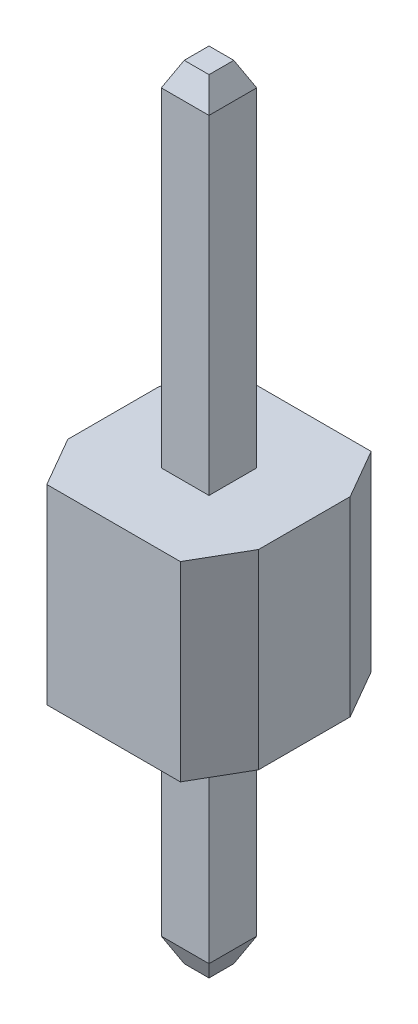
ISO-10303-21;
HEADER;
FILE_DESCRIPTION(('STEP AP214'),'2;1');
FILE_NAME('part.step','',(''),(''),'','','');
FILE_SCHEMA(('AUTOMOTIVE_DESIGN { 1 0 10303 214 1 1 1 1 }'));
ENDSEC;
DATA;
#1=APPLICATION_CONTEXT('core data for automotive mechanical design processes');
#2=APPLICATION_PROTOCOL_DEFINITION('international standard','automotive_design',2000,#1);
#3=PRODUCT_CONTEXT('',#1,'mechanical');
#4=PRODUCT('Part','Part','',(#3));
#5=PRODUCT_RELATED_PRODUCT_CATEGORY('part','',(#4));
#6=PRODUCT_DEFINITION_FORMATION('','',#4);
#7=PRODUCT_DEFINITION_CONTEXT('part definition',#1,'design');
#8=PRODUCT_DEFINITION('design','',#6,#7);
#9=PRODUCT_DEFINITION_SHAPE('','',#8);
#10=(LENGTH_UNIT() NAMED_UNIT(*) SI_UNIT(.MILLI.,.METRE.));
#11=(NAMED_UNIT(*) PLANE_ANGLE_UNIT() SI_UNIT($,.RADIAN.));
#12=(NAMED_UNIT(*) SI_UNIT($,.STERADIAN.) SOLID_ANGLE_UNIT());
#13=UNCERTAINTY_MEASURE_WITH_UNIT(LENGTH_MEASURE(1.E-05),#10,'distance_accuracy_value','');
#14=(GEOMETRIC_REPRESENTATION_CONTEXT(3) GLOBAL_UNCERTAINTY_ASSIGNED_CONTEXT((#13)) GLOBAL_UNIT_ASSIGNED_CONTEXT((#10,
#11,#12)) REPRESENTATION_CONTEXT('',''));
#15=CARTESIAN_POINT('',(0.,0.,0.));
#16=DIRECTION('',(0.,0.,1.));
#17=DIRECTION('',(1.,0.,0.));
#18=AXIS2_PLACEMENT_3D('',#15,#16,#17);
#19=CARTESIAN_POINT('',(1.,2.,1.));
#20=DIRECTION('',(-1.,0.,0.));
#21=DIRECTION('',(0.,0.,1.));
#22=AXIS2_PLACEMENT_3D('',#19,#20,#21);
#23=PLANE('',#22);
#24=DIRECTION('',(0.,0.,-1.));
#25=VECTOR('',#24,1.);
#26=CARTESIAN_POINT('',(1.,0.,1.));
#27=LINE('',#26,#25);
#28=CARTESIAN_POINT('',(1.,0.,0.479999999999997));
#29=VERTEX_POINT('',#28);
#30=CARTESIAN_POINT('',(1.,0.,-0.479999999999997));
#31=VERTEX_POINT('',#30);
#32=EDGE_CURVE('E204',#29,#31,#27,.T.);
#33=ORIENTED_EDGE('',*,*,#32,.T.);
#34=DIRECTION('',(0.,1.,0.));
#35=VECTOR('',#34,1.);
#36=CARTESIAN_POINT('',(1.,2.,-0.479999999999997));
#37=LINE('',#36,#35);
#38=CARTESIAN_POINT('',(1.,2.,-0.479999999999997));
#39=VERTEX_POINT('',#38);
#40=EDGE_CURVE('E253',#31,#39,#37,.T.);
#41=ORIENTED_EDGE('',*,*,#40,.T.);
#42=DIRECTION('',(0.,0.,-1.));
#43=VECTOR('',#42,1.);
#44=CARTESIAN_POINT('',(1.,2.,1.));
#45=LINE('',#44,#43);
#46=CARTESIAN_POINT('',(1.,2.,0.479999999999997));
#47=VERTEX_POINT('',#46);
#48=EDGE_CURVE('E205',#47,#39,#45,.T.);
#49=ORIENTED_EDGE('',*,*,#48,.F.);
#50=DIRECTION('',(0.,-1.,0.));
#51=VECTOR('',#50,1.);
#52=CARTESIAN_POINT('',(1.,2.,0.479999999999997));
#53=LINE('',#52,#51);
#54=EDGE_CURVE('E240',#47,#29,#53,.T.);
#55=ORIENTED_EDGE('',*,*,#54,.T.);
#56=EDGE_LOOP('',(#33,#41,#49,#55));
#57=FACE_BOUND('',#56,.T.);
#58=ADVANCED_FACE('F33',(#57),#23,.F.);
#59=CARTESIAN_POINT('',(-1.,2.,-1.));
#60=DIRECTION('',(0.,0.,1.));
#61=DIRECTION('',(1.,0.,0.));
#62=AXIS2_PLACEMENT_3D('',#59,#60,#61);
#63=PLANE('',#62);
#64=DIRECTION('',(-1.,0.,0.));
#65=VECTOR('',#64,1.);
#66=CARTESIAN_POINT('',(-1.,2.,-1.));
#67=LINE('',#66,#65);
#68=CARTESIAN_POINT('',(0.7,2.,-1.));
#69=VERTEX_POINT('',#68);
#70=CARTESIAN_POINT('',(-0.699999999999999,2.,-1.));
#71=VERTEX_POINT('',#70);
#72=EDGE_CURVE('E208',#69,#71,#67,.T.);
#73=ORIENTED_EDGE('',*,*,#72,.F.);
#74=DIRECTION('',(0.,-1.,0.));
#75=VECTOR('',#74,1.);
#76=CARTESIAN_POINT('',(0.7,2.,-1.));
#77=LINE('',#76,#75);
#78=CARTESIAN_POINT('',(0.7,0.,-1.));
#79=VERTEX_POINT('',#78);
#80=EDGE_CURVE('E246',#69,#79,#77,.T.);
#81=ORIENTED_EDGE('',*,*,#80,.T.);
#82=DIRECTION('',(-1.,0.,0.));
#83=VECTOR('',#82,1.);
#84=CARTESIAN_POINT('',(-1.,0.,-1.));
#85=LINE('',#84,#83);
#86=CARTESIAN_POINT('',(-0.699999999999999,0.,-1.));
#87=VERTEX_POINT('',#86);
#88=EDGE_CURVE('E219',#79,#87,#85,.T.);
#89=ORIENTED_EDGE('',*,*,#88,.T.);
#90=DIRECTION('',(0.,1.,0.));
#91=VECTOR('',#90,1.);
#92=CARTESIAN_POINT('',(-0.699999999999999,2.,-1.));
#93=LINE('',#92,#91);
#94=EDGE_CURVE('E233',#87,#71,#93,.T.);
#95=ORIENTED_EDGE('',*,*,#94,.T.);
#96=EDGE_LOOP('',(#73,#81,#89,#95));
#97=FACE_BOUND('',#96,.T.);
#98=ADVANCED_FACE('F392',(#97),#63,.F.);
#99=CARTESIAN_POINT('',(-1.,2.,1.));
#100=DIRECTION('',(1.,0.,0.));
#101=DIRECTION('',(0.,0.,-1.));
#102=AXIS2_PLACEMENT_3D('',#99,#100,#101);
#103=PLANE('',#102);
#104=DIRECTION('',(0.,0.,1.));
#105=VECTOR('',#104,1.);
#106=CARTESIAN_POINT('',(-1.,0.,1.));
#107=LINE('',#106,#105);
#108=CARTESIAN_POINT('',(-1.,0.,-0.479999999999997));
#109=VERTEX_POINT('',#108);
#110=CARTESIAN_POINT('',(-1.,0.,0.479999999999997));
#111=VERTEX_POINT('',#110);
#112=EDGE_CURVE('E221',#109,#111,#107,.T.);
#113=ORIENTED_EDGE('',*,*,#112,.T.);
#114=DIRECTION('',(0.,1.,0.));
#115=VECTOR('',#114,1.);
#116=CARTESIAN_POINT('',(-1.,2.,0.479999999999997));
#117=LINE('',#116,#115);
#118=CARTESIAN_POINT('',(-1.,2.,0.479999999999997));
#119=VERTEX_POINT('',#118);
#120=EDGE_CURVE('E262',#111,#119,#117,.T.);
#121=ORIENTED_EDGE('',*,*,#120,.T.);
#122=DIRECTION('',(0.,0.,1.));
#123=VECTOR('',#122,1.);
#124=CARTESIAN_POINT('',(-1.,2.,1.));
#125=LINE('',#124,#123);
#126=CARTESIAN_POINT('',(-1.,2.,-0.479999999999997));
#127=VERTEX_POINT('',#126);
#128=EDGE_CURVE('E211',#127,#119,#125,.T.);
#129=ORIENTED_EDGE('',*,*,#128,.F.);
#130=DIRECTION('',(0.,-1.,0.));
#131=VECTOR('',#130,1.);
#132=CARTESIAN_POINT('',(-1.,2.,-0.479999999999997));
#133=LINE('',#132,#131);
#134=EDGE_CURVE('E216',#127,#109,#133,.T.);
#135=ORIENTED_EDGE('',*,*,#134,.T.);
#136=EDGE_LOOP('',(#113,#121,#129,#135));
#137=FACE_BOUND('',#136,.T.);
#138=ADVANCED_FACE('F398',(#137),#103,.F.);
#139=CARTESIAN_POINT('',(-1.,2.,1.));
#140=DIRECTION('',(0.,0.,-1.));
#141=DIRECTION('',(-1.,0.,0.));
#142=AXIS2_PLACEMENT_3D('',#139,#140,#141);
#143=PLANE('',#142);
#144=DIRECTION('',(1.,0.,0.));
#145=VECTOR('',#144,1.);
#146=CARTESIAN_POINT('',(-1.,2.,1.));
#147=LINE('',#146,#145);
#148=CARTESIAN_POINT('',(-0.7,2.,1.));
#149=VERTEX_POINT('',#148);
#150=CARTESIAN_POINT('',(0.699999999999999,2.,1.));
#151=VERTEX_POINT('',#150);
#152=EDGE_CURVE('E214',#149,#151,#147,.T.);
#153=ORIENTED_EDGE('',*,*,#152,.F.);
#154=DIRECTION('',(0.,-1.,0.));
#155=VECTOR('',#154,1.);
#156=CARTESIAN_POINT('',(-0.7,2.,1.));
#157=LINE('',#156,#155);
#158=CARTESIAN_POINT('',(-0.7,0.,1.));
#159=VERTEX_POINT('',#158);
#160=EDGE_CURVE('E259',#149,#159,#157,.T.);
#161=ORIENTED_EDGE('',*,*,#160,.T.);
#162=DIRECTION('',(1.,0.,0.));
#163=VECTOR('',#162,1.);
#164=CARTESIAN_POINT('',(-1.,0.,1.));
#165=LINE('',#164,#163);
#166=CARTESIAN_POINT('',(0.699999999999999,0.,1.));
#167=VERTEX_POINT('',#166);
#168=EDGE_CURVE('E209',#159,#167,#165,.T.);
#169=ORIENTED_EDGE('',*,*,#168,.T.);
#170=DIRECTION('',(0.,1.,0.));
#171=VECTOR('',#170,1.);
#172=CARTESIAN_POINT('',(0.699999999999999,2.,1.));
#173=LINE('',#172,#171);
#174=EDGE_CURVE('E243',#167,#151,#173,.T.);
#175=ORIENTED_EDGE('',*,*,#174,.T.);
#176=EDGE_LOOP('',(#153,#161,#169,#175));
#177=FACE_BOUND('',#176,.T.);
#178=ADVANCED_FACE('F502',(#177),#143,.F.);
#179=CARTESIAN_POINT('',(0.,2.,0.));
#180=DIRECTION('',(0.,-1.,0.));
#181=DIRECTION('',(0.,0.,-1.));
#182=AXIS2_PLACEMENT_3D('',#179,#180,#181);
#183=PLANE('',#182);
#184=DIRECTION('',(1.,0.,0.));
#185=VECTOR('',#184,1.);
#186=CARTESIAN_POINT('',(0.,2.,-0.249999999999999));
#187=LINE('',#186,#185);
#188=CARTESIAN_POINT('',(-0.25,2.,-0.249999999999999));
#189=VERTEX_POINT('',#188);
#190=CARTESIAN_POINT('',(0.25,2.,-0.249999999999999));
#191=VERTEX_POINT('',#190);
#192=EDGE_CURVE('E171',#189,#191,#187,.T.);
#193=ORIENTED_EDGE('',*,*,#192,.T.);
#194=DIRECTION('',(0.,0.,1.));
#195=VECTOR('',#194,1.);
#196=CARTESIAN_POINT('',(0.25,2.,0.));
#197=LINE('',#196,#195);
#198=CARTESIAN_POINT('',(0.25,2.,0.249999999999999));
#199=VERTEX_POINT('',#198);
#200=EDGE_CURVE('E199',#191,#199,#197,.T.);
#201=ORIENTED_EDGE('',*,*,#200,.T.);
#202=DIRECTION('',(-1.,0.,0.));
#203=VECTOR('',#202,1.);
#204=CARTESIAN_POINT('',(0.,2.,0.249999999999999));
#205=LINE('',#204,#203);
#206=CARTESIAN_POINT('',(-0.25,2.,0.249999999999999));
#207=VERTEX_POINT('',#206);
#208=EDGE_CURVE('E197',#199,#207,#205,.T.);
#209=ORIENTED_EDGE('',*,*,#208,.T.);
#210=DIRECTION('',(0.,0.,-1.));
#211=VECTOR('',#210,1.);
#212=CARTESIAN_POINT('',(-0.25,2.,0.));
#213=LINE('',#212,#211);
#214=EDGE_CURVE('E182',#207,#189,#213,.T.);
#215=ORIENTED_EDGE('',*,*,#214,.T.);
#216=EDGE_LOOP('',(#193,#201,#209,#215));
#217=FACE_BOUND('',#216,.T.);
#218=ORIENTED_EDGE('',*,*,#48,.T.);
#219=DIRECTION('',(0.499722453489576,0.,0.866185586048601));
#220=VECTOR('',#219,1.);
#221=CARTESIAN_POINT('',(0.7,2.,-1.));
#222=LINE('',#221,#220);
#223=EDGE_CURVE('E257',#39,#69,#222,.F.);
#224=ORIENTED_EDGE('',*,*,#223,.T.);
#225=ORIENTED_EDGE('',*,*,#72,.T.);
#226=DIRECTION('',(0.499722453489576,0.,-0.866185586048601));
#227=VECTOR('',#226,1.);
#228=CARTESIAN_POINT('',(-1.,2.,-0.479999999999997));
#229=LINE('',#228,#227);
#230=EDGE_CURVE('E238',#71,#127,#229,.F.);
#231=ORIENTED_EDGE('',*,*,#230,.T.);
#232=ORIENTED_EDGE('',*,*,#128,.T.);
#233=DIRECTION('',(-0.499722453489576,0.,-0.866185586048601));
#234=VECTOR('',#233,1.);
#235=CARTESIAN_POINT('',(-0.7,2.,1.));
#236=LINE('',#235,#234);
#237=EDGE_CURVE('E255',#119,#149,#236,.F.);
#238=ORIENTED_EDGE('',*,*,#237,.T.);
#239=ORIENTED_EDGE('',*,*,#152,.T.);
#240=DIRECTION('',(-0.499722453489576,0.,0.866185586048601));
#241=VECTOR('',#240,1.);
#242=CARTESIAN_POINT('',(1.,2.,0.479999999999997));
#243=LINE('',#242,#241);
#244=EDGE_CURVE('E236',#151,#47,#243,.F.);
#245=ORIENTED_EDGE('',*,*,#244,.T.);
#246=EDGE_LOOP('',(#218,#224,#225,#231,#232,#238,#239,#245));
#247=FACE_BOUND('',#246,.T.);
#248=ADVANCED_FACE('F195',(#217,#247),#183,.F.);
#249=CARTESIAN_POINT('',(0.,0.,0.));
#250=DIRECTION('',(0.,-1.,0.));
#251=DIRECTION('',(0.,0.,-1.));
#252=AXIS2_PLACEMENT_3D('',#249,#250,#251);
#253=PLANE('',#252);
#254=DIRECTION('',(0.,0.,1.));
#255=VECTOR('',#254,1.);
#256=CARTESIAN_POINT('',(0.25,0.,0.));
#257=LINE('',#256,#255);
#258=CARTESIAN_POINT('',(0.25,0.,-0.249999999999999));
#259=VERTEX_POINT('',#258);
#260=CARTESIAN_POINT('',(0.25,0.,0.249999999999999));
#261=VERTEX_POINT('',#260);
#262=EDGE_CURVE('E273',#259,#261,#257,.T.);
#263=ORIENTED_EDGE('',*,*,#262,.F.);
#264=DIRECTION('',(1.,0.,0.));
#265=VECTOR('',#264,1.);
#266=CARTESIAN_POINT('',(0.,0.,-0.249999999999999));
#267=LINE('',#266,#265);
#268=CARTESIAN_POINT('',(-0.25,0.,-0.249999999999999));
#269=VERTEX_POINT('',#268);
#270=EDGE_CURVE('E264',#269,#259,#267,.T.);
#271=ORIENTED_EDGE('',*,*,#270,.F.);
#272=DIRECTION('',(0.,0.,-1.));
#273=VECTOR('',#272,1.);
#274=CARTESIAN_POINT('',(-0.25,0.,0.));
#275=LINE('',#274,#273);
#276=CARTESIAN_POINT('',(-0.25,0.,0.249999999999999));
#277=VERTEX_POINT('',#276);
#278=EDGE_CURVE('E267',#277,#269,#275,.T.);
#279=ORIENTED_EDGE('',*,*,#278,.F.);
#280=DIRECTION('',(-1.,0.,0.));
#281=VECTOR('',#280,1.);
#282=CARTESIAN_POINT('',(0.,0.,0.249999999999999));
#283=LINE('',#282,#281);
#284=EDGE_CURVE('E270',#261,#277,#283,.T.);
#285=ORIENTED_EDGE('',*,*,#284,.F.);
#286=EDGE_LOOP('',(#263,#271,#279,#285));
#287=FACE_BOUND('',#286,.T.);
#288=ORIENTED_EDGE('',*,*,#88,.F.);
#289=DIRECTION('',(-0.499722453489576,0.,-0.866185586048601));
#290=VECTOR('',#289,1.);
#291=CARTESIAN_POINT('',(0.958046614872364,0.,-0.5527192008879));
#292=LINE('',#291,#290);
#293=EDGE_CURVE('E251',#79,#31,#292,.F.);
#294=ORIENTED_EDGE('',*,*,#293,.T.);
#295=ORIENTED_EDGE('',*,*,#32,.F.);
#296=DIRECTION('',(0.499722453489576,0.,-0.866185586048601));
#297=VECTOR('',#296,1.);
#298=CARTESIAN_POINT('',(0.958046614872364,0.,0.5527192008879));
#299=LINE('',#298,#297);
#300=EDGE_CURVE('E227',#29,#167,#299,.F.);
#301=ORIENTED_EDGE('',*,*,#300,.T.);
#302=ORIENTED_EDGE('',*,*,#168,.F.);
#303=DIRECTION('',(0.499722453489576,0.,0.866185586048601));
#304=VECTOR('',#303,1.);
#305=CARTESIAN_POINT('',(-0.958046614872364,0.,0.5527192008879));
#306=LINE('',#305,#304);
#307=EDGE_CURVE('E249',#159,#111,#306,.F.);
#308=ORIENTED_EDGE('',*,*,#307,.T.);
#309=ORIENTED_EDGE('',*,*,#112,.F.);
#310=DIRECTION('',(-0.499722453489576,0.,0.866185586048601));
#311=VECTOR('',#310,1.);
#312=CARTESIAN_POINT('',(-0.958046614872364,0.,-0.5527192008879));
#313=LINE('',#312,#311);
#314=EDGE_CURVE('E230',#109,#87,#313,.F.);
#315=ORIENTED_EDGE('',*,*,#314,.T.);
#316=EDGE_LOOP('',(#288,#294,#295,#301,#302,#308,#309,#315));
#317=FACE_BOUND('',#316,.T.);
#318=ADVANCED_FACE('F378',(#287,#317),#253,.T.);
#319=CARTESIAN_POINT('',(-1.,2.,-0.479999999999997));
#320=DIRECTION('',(0.866185586048601,0.,0.499722453489576));
#321=DIRECTION('',(0.,-1.,0.));
#322=AXIS2_PLACEMENT_3D('',#319,#320,#321);
#323=PLANE('',#322);
#324=ORIENTED_EDGE('',*,*,#230,.F.);
#325=ORIENTED_EDGE('',*,*,#94,.F.);
#326=ORIENTED_EDGE('',*,*,#314,.F.);
#327=ORIENTED_EDGE('',*,*,#134,.F.);
#328=EDGE_LOOP('',(#324,#325,#326,#327));
#329=FACE_BOUND('',#328,.T.);
#330=ADVANCED_FACE('F403',(#329),#323,.F.);
#331=CARTESIAN_POINT('',(1.,2.,0.479999999999997));
#332=DIRECTION('',(-0.866185586048601,0.,-0.499722453489576));
#333=DIRECTION('',(0.,-1.,0.));
#334=AXIS2_PLACEMENT_3D('',#331,#332,#333);
#335=PLANE('',#334);
#336=ORIENTED_EDGE('',*,*,#244,.F.);
#337=ORIENTED_EDGE('',*,*,#174,.F.);
#338=ORIENTED_EDGE('',*,*,#300,.F.);
#339=ORIENTED_EDGE('',*,*,#54,.F.);
#340=EDGE_LOOP('',(#336,#337,#338,#339));
#341=FACE_BOUND('',#340,.T.);
#342=ADVANCED_FACE('F406',(#341),#335,.F.);
#343=CARTESIAN_POINT('',(0.7,2.,-1.));
#344=DIRECTION('',(-0.866185586048601,0.,0.499722453489576));
#345=DIRECTION('',(0.,-1.,0.));
#346=AXIS2_PLACEMENT_3D('',#343,#344,#345);
#347=PLANE('',#346);
#348=ORIENTED_EDGE('',*,*,#223,.F.);
#349=ORIENTED_EDGE('',*,*,#40,.F.);
#350=ORIENTED_EDGE('',*,*,#293,.F.);
#351=ORIENTED_EDGE('',*,*,#80,.F.);
#352=EDGE_LOOP('',(#348,#349,#350,#351));
#353=FACE_BOUND('',#352,.T.);
#354=ADVANCED_FACE('F410',(#353),#347,.F.);
#355=CARTESIAN_POINT('',(-0.7,2.,1.));
#356=DIRECTION('',(0.866185586048601,0.,-0.499722453489576));
#357=DIRECTION('',(0.,-1.,0.));
#358=AXIS2_PLACEMENT_3D('',#355,#356,#357);
#359=PLANE('',#358);
#360=ORIENTED_EDGE('',*,*,#237,.F.);
#361=ORIENTED_EDGE('',*,*,#120,.F.);
#362=ORIENTED_EDGE('',*,*,#307,.F.);
#363=ORIENTED_EDGE('',*,*,#160,.F.);
#364=EDGE_LOOP('',(#360,#361,#362,#363));
#365=FACE_BOUND('',#364,.T.);
#366=ADVANCED_FACE('F414',(#365),#359,.F.);
#367=CARTESIAN_POINT('',(0.,-2.5,0.));
#368=DIRECTION('',(0.,-1.,0.));
#369=DIRECTION('',(0.,0.,-1.));
#370=AXIS2_PLACEMENT_3D('',#367,#368,#369);
#371=PLANE('',#370);
#372=DIRECTION('',(0.,0.,-1.));
#373=VECTOR('',#372,1.);
#374=CARTESIAN_POINT('',(-0.129999999999999,-2.5,0.));
#375=LINE('',#374,#373);
#376=CARTESIAN_POINT('',(-0.129999999999999,-2.5,0.129999999999998));
#377=VERTEX_POINT('',#376);
#378=CARTESIAN_POINT('',(-0.129999999999999,-2.5,-0.129999999999998));
#379=VERTEX_POINT('',#378);
#380=EDGE_CURVE('E310',#377,#379,#375,.T.);
#381=ORIENTED_EDGE('',*,*,#380,.T.);
#382=DIRECTION('',(1.,0.,0.));
#383=VECTOR('',#382,1.);
#384=CARTESIAN_POINT('',(0.,-2.5,-0.129999999999998));
#385=LINE('',#384,#383);
#386=CARTESIAN_POINT('',(0.129999999999999,-2.5,-0.129999999999998));
#387=VERTEX_POINT('',#386);
#388=EDGE_CURVE('E312',#379,#387,#385,.T.);
#389=ORIENTED_EDGE('',*,*,#388,.T.);
#390=DIRECTION('',(0.,0.,1.));
#391=VECTOR('',#390,1.);
#392=CARTESIAN_POINT('',(0.129999999999999,-2.5,0.));
#393=LINE('',#392,#391);
#394=CARTESIAN_POINT('',(0.129999999999999,-2.5,0.129999999999998));
#395=VERTEX_POINT('',#394);
#396=EDGE_CURVE('E306',#387,#395,#393,.T.);
#397=ORIENTED_EDGE('',*,*,#396,.T.);
#398=DIRECTION('',(-1.,0.,0.));
#399=VECTOR('',#398,1.);
#400=CARTESIAN_POINT('',(0.,-2.5,0.129999999999998));
#401=LINE('',#400,#399);
#402=EDGE_CURVE('E308',#395,#377,#401,.T.);
#403=ORIENTED_EDGE('',*,*,#402,.T.);
#404=EDGE_LOOP('',(#381,#389,#397,#403));
#405=FACE_BOUND('',#404,.T.);
#406=ADVANCED_FACE('F335',(#405),#371,.T.);
#407=CARTESIAN_POINT('',(-0.25,-2.5,-0.249999999999999));
#408=DIRECTION('',(0.,0.,-1.));
#409=DIRECTION('',(-1.,0.,0.));
#410=AXIS2_PLACEMENT_3D('',#407,#408,#409);
#411=PLANE('',#410);
#412=DIRECTION('',(0.,1.,0.));
#413=VECTOR('',#412,1.);
#414=CARTESIAN_POINT('',(0.25,-2.5,-0.249999999999999));
#415=LINE('',#414,#413);
#416=CARTESIAN_POINT('',(0.25,-2.25,-0.249999999999999));
#417=VERTEX_POINT('',#416);
#418=EDGE_CURVE('E192',#417,#259,#415,.T.);
#419=ORIENTED_EDGE('',*,*,#418,.F.);
#420=DIRECTION('',(-1.,0.,0.));
#421=VECTOR('',#420,1.);
#422=CARTESIAN_POINT('',(-0.25,-2.25,-0.249999999999999));
#423=LINE('',#422,#421);
#424=CARTESIAN_POINT('',(-0.25,-2.25,-0.249999999999999));
#425=VERTEX_POINT('',#424);
#426=EDGE_CURVE('E293',#417,#425,#423,.T.);
#427=ORIENTED_EDGE('',*,*,#426,.T.);
#428=DIRECTION('',(0.,1.,0.));
#429=VECTOR('',#428,1.);
#430=CARTESIAN_POINT('',(-0.25,-2.5,-0.249999999999999));
#431=LINE('',#430,#429);
#432=EDGE_CURVE('E191',#425,#269,#431,.T.);
#433=ORIENTED_EDGE('',*,*,#432,.T.);
#434=ORIENTED_EDGE('',*,*,#270,.T.);
#435=EDGE_LOOP('',(#419,#427,#433,#434));
#436=FACE_BOUND('',#435,.T.);
#437=ADVANCED_FACE('F344',(#436),#411,.T.);
#438=CARTESIAN_POINT('',(-0.25,-2.5,0.249999999999999));
#439=DIRECTION('',(-1.,0.,0.));
#440=DIRECTION('',(0.,0.,1.));
#441=AXIS2_PLACEMENT_3D('',#438,#439,#440);
#442=PLANE('',#441);
#443=ORIENTED_EDGE('',*,*,#432,.F.);
#444=DIRECTION('',(0.,0.,1.));
#445=VECTOR('',#444,1.);
#446=CARTESIAN_POINT('',(-0.25,-2.25,0.249999999999999));
#447=LINE('',#446,#445);
#448=CARTESIAN_POINT('',(-0.25,-2.25,0.249999999999999));
#449=VERTEX_POINT('',#448);
#450=EDGE_CURVE('E57',#425,#449,#447,.T.);
#451=ORIENTED_EDGE('',*,*,#450,.T.);
#452=DIRECTION('',(0.,1.,0.));
#453=VECTOR('',#452,1.);
#454=CARTESIAN_POINT('',(-0.25,-2.5,0.249999999999999));
#455=LINE('',#454,#453);
#456=EDGE_CURVE('E349',#449,#277,#455,.T.);
#457=ORIENTED_EDGE('',*,*,#456,.T.);
#458=ORIENTED_EDGE('',*,*,#278,.T.);
#459=EDGE_LOOP('',(#443,#451,#457,#458));
#460=FACE_BOUND('',#459,.T.);
#461=ADVANCED_FACE('F346',(#460),#442,.T.);
#462=CARTESIAN_POINT('',(-0.25,-2.5,0.249999999999999));
#463=DIRECTION('',(0.,0.,1.));
#464=DIRECTION('',(1.,0.,0.));
#465=AXIS2_PLACEMENT_3D('',#462,#463,#464);
#466=PLANE('',#465);
#467=ORIENTED_EDGE('',*,*,#456,.F.);
#468=DIRECTION('',(1.,0.,0.));
#469=VECTOR('',#468,1.);
#470=CARTESIAN_POINT('',(-0.25,-2.25,0.249999999999999));
#471=LINE('',#470,#469);
#472=CARTESIAN_POINT('',(0.25,-2.25,0.249999999999999));
#473=VERTEX_POINT('',#472);
#474=EDGE_CURVE('E42',#449,#473,#471,.T.);
#475=ORIENTED_EDGE('',*,*,#474,.T.);
#476=DIRECTION('',(0.,1.,0.));
#477=VECTOR('',#476,1.);
#478=CARTESIAN_POINT('',(0.25,-2.5,0.249999999999999));
#479=LINE('',#478,#477);
#480=EDGE_CURVE('E183',#473,#261,#479,.T.);
#481=ORIENTED_EDGE('',*,*,#480,.T.);
#482=ORIENTED_EDGE('',*,*,#284,.T.);
#483=EDGE_LOOP('',(#467,#475,#481,#482));
#484=FACE_BOUND('',#483,.T.);
#485=ADVANCED_FACE('F380',(#484),#466,.T.);
#486=CARTESIAN_POINT('',(0.25,-2.5,0.249999999999999));
#487=DIRECTION('',(1.,0.,0.));
#488=DIRECTION('',(0.,0.,-1.));
#489=AXIS2_PLACEMENT_3D('',#486,#487,#488);
#490=PLANE('',#489);
#491=ORIENTED_EDGE('',*,*,#480,.F.);
#492=DIRECTION('',(0.,0.,-1.));
#493=VECTOR('',#492,1.);
#494=CARTESIAN_POINT('',(0.25,-2.25,0.249999999999999));
#495=LINE('',#494,#493);
#496=EDGE_CURVE('E11',#473,#417,#495,.T.);
#497=ORIENTED_EDGE('',*,*,#496,.T.);
#498=ORIENTED_EDGE('',*,*,#418,.T.);
#499=ORIENTED_EDGE('',*,*,#262,.T.);
#500=EDGE_LOOP('',(#491,#497,#498,#499));
#501=FACE_BOUND('',#500,.T.);
#502=ADVANCED_FACE('F381',(#501),#490,.T.);
#503=CARTESIAN_POINT('',(0.25,5.45,-0.249999999999999));
#504=VERTEX_POINT('',#503);
#505=EDGE_CURVE('E177',#191,#504,#415,.T.);
#506=ORIENTED_EDGE('',*,*,#505,.T.);
#507=DIRECTION('',(0.,0.,1.));
#508=VECTOR('',#507,1.);
#509=CARTESIAN_POINT('',(0.25,5.45,0.249999999999999));
#510=LINE('',#509,#508);
#511=CARTESIAN_POINT('',(0.25,5.45,0.249999999999999));
#512=VERTEX_POINT('',#511);
#513=EDGE_CURVE('E291',#504,#512,#510,.T.);
#514=ORIENTED_EDGE('',*,*,#513,.T.);
#515=EDGE_CURVE('E375',#199,#512,#479,.T.);
#516=ORIENTED_EDGE('',*,*,#515,.F.);
#517=ORIENTED_EDGE('',*,*,#200,.F.);
#518=EDGE_LOOP('',(#506,#514,#516,#517));
#519=FACE_BOUND('',#518,.T.);
#520=ADVANCED_FACE('F356',(#519),#490,.T.);
#521=ORIENTED_EDGE('',*,*,#515,.T.);
#522=DIRECTION('',(-1.,0.,0.));
#523=VECTOR('',#522,1.);
#524=CARTESIAN_POINT('',(-0.25,5.45,0.249999999999999));
#525=LINE('',#524,#523);
#526=CARTESIAN_POINT('',(-0.25,5.45,0.249999999999999));
#527=VERTEX_POINT('',#526);
#528=EDGE_CURVE('E285',#512,#527,#525,.T.);
#529=ORIENTED_EDGE('',*,*,#528,.T.);
#530=EDGE_CURVE('E348',#207,#527,#455,.T.);
#531=ORIENTED_EDGE('',*,*,#530,.F.);
#532=ORIENTED_EDGE('',*,*,#208,.F.);
#533=EDGE_LOOP('',(#521,#529,#531,#532));
#534=FACE_BOUND('',#533,.T.);
#535=ADVANCED_FACE('F374',(#534),#466,.T.);
#536=ORIENTED_EDGE('',*,*,#530,.T.);
#537=DIRECTION('',(0.,0.,-1.));
#538=VECTOR('',#537,1.);
#539=CARTESIAN_POINT('',(-0.25,5.45,-0.249999999999999));
#540=LINE('',#539,#538);
#541=CARTESIAN_POINT('',(-0.25,5.45,-0.249999999999999));
#542=VERTEX_POINT('',#541);
#543=EDGE_CURVE('E190',#527,#542,#540,.T.);
#544=ORIENTED_EDGE('',*,*,#543,.T.);
#545=EDGE_CURVE('E174',#189,#542,#431,.T.);
#546=ORIENTED_EDGE('',*,*,#545,.F.);
#547=ORIENTED_EDGE('',*,*,#214,.F.);
#548=EDGE_LOOP('',(#536,#544,#546,#547));
#549=FACE_BOUND('',#548,.T.);
#550=ADVANCED_FACE('F187',(#549),#442,.T.);
#551=ORIENTED_EDGE('',*,*,#545,.T.);
#552=DIRECTION('',(1.,0.,0.));
#553=VECTOR('',#552,1.);
#554=CARTESIAN_POINT('',(0.25,5.45,-0.249999999999999));
#555=LINE('',#554,#553);
#556=EDGE_CURVE('E289',#542,#504,#555,.T.);
#557=ORIENTED_EDGE('',*,*,#556,.T.);
#558=ORIENTED_EDGE('',*,*,#505,.F.);
#559=ORIENTED_EDGE('',*,*,#192,.F.);
#560=EDGE_LOOP('',(#551,#557,#558,#559));
#561=FACE_BOUND('',#560,.T.);
#562=ADVANCED_FACE('F173',(#561),#411,.T.);
#563=CARTESIAN_POINT('',(0.,5.7,0.));
#564=DIRECTION('',(0.,-1.,0.));
#565=DIRECTION('',(0.,0.,-1.));
#566=AXIS2_PLACEMENT_3D('',#563,#564,#565);
#567=PLANE('',#566);
#568=DIRECTION('',(0.,0.,1.));
#569=VECTOR('',#568,1.);
#570=CARTESIAN_POINT('',(-0.13,5.7,0.249999999999999));
#571=LINE('',#570,#569);
#572=CARTESIAN_POINT('',(-0.13,5.7,-0.129999999999999));
#573=VERTEX_POINT('',#572);
#574=CARTESIAN_POINT('',(-0.13,5.7,0.129999999999999));
#575=VERTEX_POINT('',#574);
#576=EDGE_CURVE('E280',#573,#575,#571,.T.);
#577=ORIENTED_EDGE('',*,*,#576,.T.);
#578=DIRECTION('',(1.,0.,0.));
#579=VECTOR('',#578,1.);
#580=CARTESIAN_POINT('',(0.25,5.7,0.129999999999999));
#581=LINE('',#580,#579);
#582=CARTESIAN_POINT('',(0.13,5.7,0.129999999999999));
#583=VERTEX_POINT('',#582);
#584=EDGE_CURVE('E282',#575,#583,#581,.T.);
#585=ORIENTED_EDGE('',*,*,#584,.T.);
#586=DIRECTION('',(0.,0.,-1.));
#587=VECTOR('',#586,1.);
#588=CARTESIAN_POINT('',(0.13,5.7,-0.249999999999999));
#589=LINE('',#588,#587);
#590=CARTESIAN_POINT('',(0.13,5.7,-0.129999999999999));
#591=VERTEX_POINT('',#590);
#592=EDGE_CURVE('E276',#583,#591,#589,.T.);
#593=ORIENTED_EDGE('',*,*,#592,.T.);
#594=DIRECTION('',(-1.,0.,0.));
#595=VECTOR('',#594,1.);
#596=CARTESIAN_POINT('',(-0.25,5.7,-0.129999999999999));
#597=LINE('',#596,#595);
#598=EDGE_CURVE('E278',#591,#573,#597,.T.);
#599=ORIENTED_EDGE('',*,*,#598,.T.);
#600=EDGE_LOOP('',(#577,#585,#593,#599));
#601=FACE_BOUND('',#600,.T.);
#602=ADVANCED_FACE('F429',(#601),#567,.F.);
#603=CARTESIAN_POINT('',(0.,5.7,-0.129999999999999));
#604=DIRECTION('',(0.,0.432731067584769,-0.901523057468275));
#605=DIRECTION('',(1.,0.,0.));
#606=AXIS2_PLACEMENT_3D('',#603,#604,#605);
#607=PLANE('',#606);
#608=DIRECTION('',(-0.397142035392896,0.82737924040187,0.397142035392896));
#609=VECTOR('',#608,1.);
#610=CARTESIAN_POINT('',(0.109496166484119,5.74271631982475,-0.109496166484118));
#611=LINE('',#610,#609);
#612=EDGE_CURVE('E298',#504,#591,#611,.T.);
#613=ORIENTED_EDGE('',*,*,#612,.F.);
#614=ORIENTED_EDGE('',*,*,#556,.F.);
#615=DIRECTION('',(0.397142035392896,0.82737924040187,0.397142035392896));
#616=VECTOR('',#615,1.);
#617=CARTESIAN_POINT('',(-0.109496166484118,5.74271631982475,-0.109496166484118));
#618=LINE('',#617,#616);
#619=EDGE_CURVE('E301',#573,#542,#618,.F.);
#620=ORIENTED_EDGE('',*,*,#619,.F.);
#621=ORIENTED_EDGE('',*,*,#598,.F.);
#622=EDGE_LOOP('',(#613,#614,#620,#621));
#623=FACE_BOUND('',#622,.T.);
#624=ADVANCED_FACE('F362',(#623),#607,.T.);
#625=CARTESIAN_POINT('',(-0.13,5.7,0.));
#626=DIRECTION('',(-0.901523057468275,0.432731067584769,0.));
#627=DIRECTION('',(0.,0.,-1.));
#628=AXIS2_PLACEMENT_3D('',#625,#626,#627);
#629=PLANE('',#628);
#630=ORIENTED_EDGE('',*,*,#619,.T.);
#631=ORIENTED_EDGE('',*,*,#543,.F.);
#632=DIRECTION('',(0.397142035392896,0.82737924040187,-0.397142035392896));
#633=VECTOR('',#632,1.);
#634=CARTESIAN_POINT('',(-0.109496166484119,5.74271631982475,0.109496166484118));
#635=LINE('',#634,#633);
#636=EDGE_CURVE('E296',#575,#527,#635,.F.);
#637=ORIENTED_EDGE('',*,*,#636,.F.);
#638=ORIENTED_EDGE('',*,*,#576,.F.);
#639=EDGE_LOOP('',(#630,#631,#637,#638));
#640=FACE_BOUND('',#639,.T.);
#641=ADVANCED_FACE('F423',(#640),#629,.T.);
#642=CARTESIAN_POINT('',(0.13,5.7,0.));
#643=DIRECTION('',(0.901523057468275,0.432731067584769,0.));
#644=DIRECTION('',(0.,0.,1.));
#645=AXIS2_PLACEMENT_3D('',#642,#643,#644);
#646=PLANE('',#645);
#647=ORIENTED_EDGE('',*,*,#612,.T.);
#648=ORIENTED_EDGE('',*,*,#592,.F.);
#649=DIRECTION('',(0.397142035392896,-0.82737924040187,0.397142035392896));
#650=VECTOR('',#649,1.);
#651=CARTESIAN_POINT('',(0.109496166484119,5.74271631982475,0.109496166484118));
#652=LINE('',#651,#650);
#653=EDGE_CURVE('E294',#512,#583,#652,.F.);
#654=ORIENTED_EDGE('',*,*,#653,.F.);
#655=ORIENTED_EDGE('',*,*,#513,.F.);
#656=EDGE_LOOP('',(#647,#648,#654,#655));
#657=FACE_BOUND('',#656,.T.);
#658=ADVANCED_FACE('F367',(#657),#646,.T.);
#659=CARTESIAN_POINT('',(0.,5.7,0.129999999999999));
#660=DIRECTION('',(0.,0.432731067584769,0.901523057468275));
#661=DIRECTION('',(-1.,0.,0.));
#662=AXIS2_PLACEMENT_3D('',#659,#660,#661);
#663=PLANE('',#662);
#664=ORIENTED_EDGE('',*,*,#636,.T.);
#665=ORIENTED_EDGE('',*,*,#528,.F.);
#666=ORIENTED_EDGE('',*,*,#653,.T.);
#667=ORIENTED_EDGE('',*,*,#584,.F.);
#668=EDGE_LOOP('',(#664,#665,#666,#667));
#669=FACE_BOUND('',#668,.T.);
#670=ADVANCED_FACE('F371',(#669),#663,.T.);
#671=CARTESIAN_POINT('',(-0.25,-2.25,0.249999999999999));
#672=DIRECTION('',(0.,0.43273106758477,-0.901523057468274));
#673=DIRECTION('',(1.,0.,0.));
#674=AXIS2_PLACEMENT_3D('',#671,#672,#673);
#675=PLANE('',#674);
#676=DIRECTION('',(0.397142035392896,-0.82737924040187,-0.397142035392896));
#677=VECTOR('',#676,1.);
#678=CARTESIAN_POINT('',(-0.25,-2.25,0.249999999999999));
#679=LINE('',#678,#677);
#680=EDGE_CURVE('E320',#377,#449,#679,.F.);
#681=ORIENTED_EDGE('',*,*,#680,.F.);
#682=ORIENTED_EDGE('',*,*,#402,.F.);
#683=DIRECTION('',(-0.397142035392896,-0.82737924040187,-0.397142035392896));
#684=VECTOR('',#683,1.);
#685=CARTESIAN_POINT('',(0.25,-2.25,0.249999999999999));
#686=LINE('',#685,#684);
#687=EDGE_CURVE('E37',#473,#395,#686,.T.);
#688=ORIENTED_EDGE('',*,*,#687,.F.);
#689=ORIENTED_EDGE('',*,*,#474,.F.);
#690=EDGE_LOOP('',(#681,#682,#688,#689));
#691=FACE_BOUND('',#690,.T.);
#692=ADVANCED_FACE('F35',(#691),#675,.F.);
#693=CARTESIAN_POINT('',(0.25,-2.25,0.249999999999999));
#694=DIRECTION('',(-0.901523057468274,0.43273106758477,0.));
#695=DIRECTION('',(0.,0.,-1.));
#696=AXIS2_PLACEMENT_3D('',#693,#694,#695);
#697=PLANE('',#696);
#698=ORIENTED_EDGE('',*,*,#687,.T.);
#699=ORIENTED_EDGE('',*,*,#396,.F.);
#700=DIRECTION('',(0.397142035392896,0.82737924040187,-0.397142035392896));
#701=VECTOR('',#700,1.);
#702=CARTESIAN_POINT('',(0.171139101861994,-2.41429353778751,-0.171139101861993));
#703=LINE('',#702,#701);
#704=EDGE_CURVE('E319',#417,#387,#703,.F.);
#705=ORIENTED_EDGE('',*,*,#704,.F.);
#706=ORIENTED_EDGE('',*,*,#496,.F.);
#707=EDGE_LOOP('',(#698,#699,#705,#706));
#708=FACE_BOUND('',#707,.T.);
#709=ADVANCED_FACE('F330',(#708),#697,.F.);
#710=CARTESIAN_POINT('',(-0.25,-2.25,0.249999999999999));
#711=DIRECTION('',(0.901523057468274,0.43273106758477,0.));
#712=DIRECTION('',(0.,0.,1.));
#713=AXIS2_PLACEMENT_3D('',#710,#711,#712);
#714=PLANE('',#713);
#715=ORIENTED_EDGE('',*,*,#680,.T.);
#716=ORIENTED_EDGE('',*,*,#450,.F.);
#717=DIRECTION('',(0.397142035392896,-0.82737924040187,0.397142035392896));
#718=VECTOR('',#717,1.);
#719=CARTESIAN_POINT('',(-0.171139101861994,-2.41429353778751,-0.171139101861993));
#720=LINE('',#719,#718);
#721=EDGE_CURVE('E317',#379,#425,#720,.F.);
#722=ORIENTED_EDGE('',*,*,#721,.F.);
#723=ORIENTED_EDGE('',*,*,#380,.F.);
#724=EDGE_LOOP('',(#715,#716,#722,#723));
#725=FACE_BOUND('',#724,.T.);
#726=ADVANCED_FACE('F341',(#725),#714,.F.);
#727=CARTESIAN_POINT('',(-0.25,-2.25,-0.249999999999999));
#728=DIRECTION('',(0.,0.43273106758477,0.901523057468274));
#729=DIRECTION('',(-1.,0.,0.));
#730=AXIS2_PLACEMENT_3D('',#727,#728,#729);
#731=PLANE('',#730);
#732=ORIENTED_EDGE('',*,*,#704,.T.);
#733=ORIENTED_EDGE('',*,*,#388,.F.);
#734=ORIENTED_EDGE('',*,*,#721,.T.);
#735=ORIENTED_EDGE('',*,*,#426,.F.);
#736=EDGE_LOOP('',(#732,#733,#734,#735));
#737=FACE_BOUND('',#736,.T.);
#738=ADVANCED_FACE('F339',(#737),#731,.F.);
#739=CLOSED_SHELL('',(#58,#98,#138,#178,#248,#318,#330,#342,#354,#366,#406,#437,#461,#485,#502,
#520,#535,#550,#562,#602,#624,#641,#658,#670,#692,#709,#726,#738));
#740=MANIFOLD_SOLID_BREP('B2',#739);
#741=ADVANCED_BREP_SHAPE_REPRESENTATION('',(#18,#740),#14);
#742=SHAPE_DEFINITION_REPRESENTATION(#9,#741);
ENDSEC;
END-ISO-10303-21;
